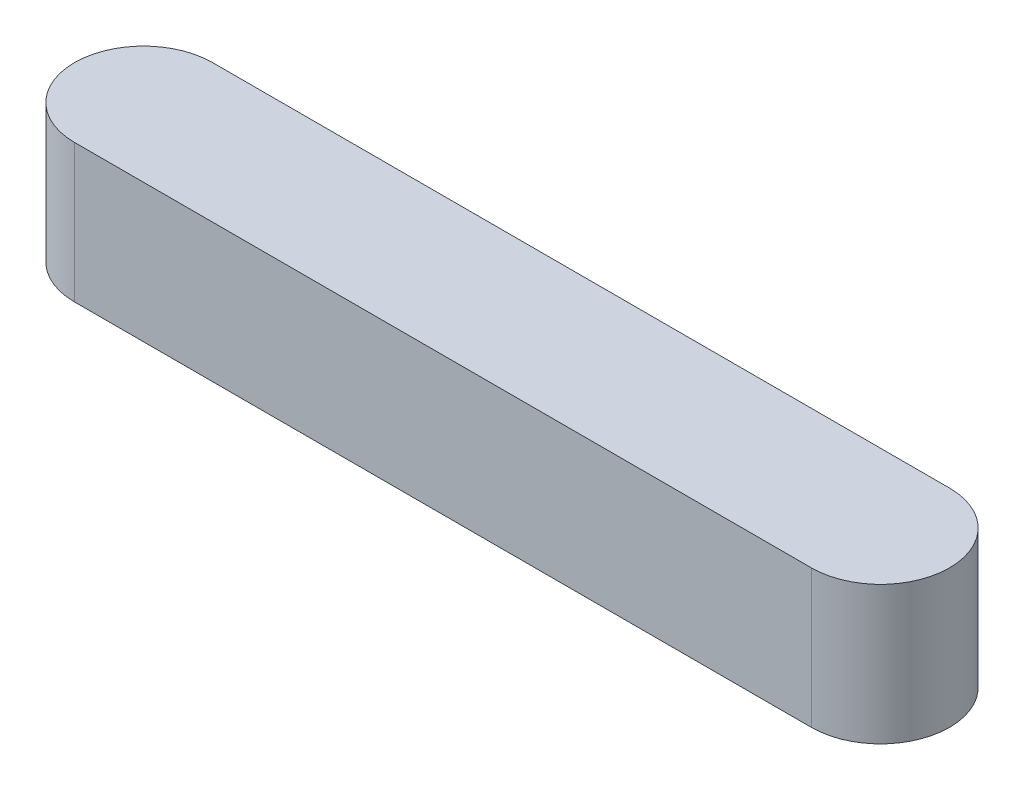
ISO-10303-21;
HEADER;
FILE_DESCRIPTION(('STEP AP214'),'2;1');
FILE_NAME('part.step','',(''),(''),'','','');
FILE_SCHEMA(('AUTOMOTIVE_DESIGN { 1 0 10303 214 1 1 1 1 }'));
ENDSEC;
DATA;
#1=APPLICATION_CONTEXT('core data for automotive mechanical design processes');
#2=APPLICATION_PROTOCOL_DEFINITION('international standard','automotive_design',2000,#1);
#3=PRODUCT_CONTEXT('',#1,'mechanical');
#4=PRODUCT('Part','Part','',(#3));
#5=PRODUCT_RELATED_PRODUCT_CATEGORY('part','',(#4));
#6=PRODUCT_DEFINITION_FORMATION('','',#4);
#7=PRODUCT_DEFINITION_CONTEXT('part definition',#1,'design');
#8=PRODUCT_DEFINITION('design','',#6,#7);
#9=PRODUCT_DEFINITION_SHAPE('','',#8);
#10=(LENGTH_UNIT() NAMED_UNIT(*) SI_UNIT(.MILLI.,.METRE.));
#11=(NAMED_UNIT(*) PLANE_ANGLE_UNIT() SI_UNIT($,.RADIAN.));
#12=(NAMED_UNIT(*) SI_UNIT($,.STERADIAN.) SOLID_ANGLE_UNIT());
#13=UNCERTAINTY_MEASURE_WITH_UNIT(LENGTH_MEASURE(1.E-05),#10,'distance_accuracy_value','');
#14=(GEOMETRIC_REPRESENTATION_CONTEXT(3) GLOBAL_UNCERTAINTY_ASSIGNED_CONTEXT((#13)) GLOBAL_UNIT_ASSIGNED_CONTEXT((#10,
#11,#12)) REPRESENTATION_CONTEXT('',''));
#15=CARTESIAN_POINT('',(0.,0.,0.));
#16=DIRECTION('',(0.,0.,1.));
#17=DIRECTION('',(1.,0.,0.));
#18=AXIS2_PLACEMENT_3D('',#15,#16,#17);
#19=CARTESIAN_POINT('',(-8.,3.,0.));
#20=DIRECTION('',(0.,-1.,0.));
#21=DIRECTION('',(0.,0.,-1.));
#22=AXIS2_PLACEMENT_3D('',#19,#20,#21);
#23=CYLINDRICAL_SURFACE('',#22,1.5);
#24=CARTESIAN_POINT('',(-8.,0.,0.));
#25=DIRECTION('',(0.,1.,0.));
#26=DIRECTION('',(0.,0.,1.));
#27=AXIS2_PLACEMENT_3D('',#24,#25,#26);
#28=CIRCLE('',#27,1.5);
#29=CARTESIAN_POINT('',(-8.,0.,-1.5));
#30=VERTEX_POINT('',#29);
#31=CARTESIAN_POINT('',(-8.,0.,1.5));
#32=VERTEX_POINT('',#31);
#33=EDGE_CURVE('E100',#30,#32,#28,.T.);
#34=ORIENTED_EDGE('',*,*,#33,.T.);
#35=DIRECTION('',(0.,-1.,0.));
#36=VECTOR('',#35,1.);
#37=CARTESIAN_POINT('',(-8.,3.,1.5));
#38=LINE('',#37,#36);
#39=CARTESIAN_POINT('',(-8.,3.,1.5));
#40=VERTEX_POINT('',#39);
#41=EDGE_CURVE('E11',#40,#32,#38,.T.);
#42=ORIENTED_EDGE('',*,*,#41,.F.);
#43=CARTESIAN_POINT('',(-8.,3.,0.));
#44=DIRECTION('',(0.,1.,0.));
#45=DIRECTION('',(0.,0.,1.));
#46=AXIS2_PLACEMENT_3D('',#43,#44,#45);
#47=CIRCLE('',#46,1.5);
#48=CARTESIAN_POINT('',(-8.,3.,-1.5));
#49=VERTEX_POINT('',#48);
#50=EDGE_CURVE('E88',#49,#40,#47,.T.);
#51=ORIENTED_EDGE('',*,*,#50,.F.);
#52=DIRECTION('',(0.,-1.,0.));
#53=VECTOR('',#52,1.);
#54=CARTESIAN_POINT('',(-8.,3.,-1.5));
#55=LINE('',#54,#53);
#56=EDGE_CURVE('E96',#49,#30,#55,.T.);
#57=ORIENTED_EDGE('',*,*,#56,.T.);
#58=EDGE_LOOP('',(#34,#42,#51,#57));
#59=FACE_BOUND('',#58,.T.);
#60=ADVANCED_FACE('F37',(#59),#23,.T.);
#61=CARTESIAN_POINT('',(-8.,3.,1.5));
#62=DIRECTION('',(0.,0.,-1.));
#63=DIRECTION('',(-1.,0.,0.));
#64=AXIS2_PLACEMENT_3D('',#61,#62,#63);
#65=PLANE('',#64);
#66=DIRECTION('',(1.,0.,0.));
#67=VECTOR('',#66,1.);
#68=CARTESIAN_POINT('',(-8.,0.,1.5));
#69=LINE('',#68,#67);
#70=CARTESIAN_POINT('',(8.,0.,1.5));
#71=VERTEX_POINT('',#70);
#72=EDGE_CURVE('E92',#32,#71,#69,.T.);
#73=ORIENTED_EDGE('',*,*,#72,.T.);
#74=DIRECTION('',(0.,-1.,0.));
#75=VECTOR('',#74,1.);
#76=CARTESIAN_POINT('',(8.,3.,1.5));
#77=LINE('',#76,#75);
#78=CARTESIAN_POINT('',(8.,3.,1.5));
#79=VERTEX_POINT('',#78);
#80=EDGE_CURVE('E45',#79,#71,#77,.T.);
#81=ORIENTED_EDGE('',*,*,#80,.F.);
#82=DIRECTION('',(1.,0.,0.));
#83=VECTOR('',#82,1.);
#84=CARTESIAN_POINT('',(-8.,3.,1.5));
#85=LINE('',#84,#83);
#86=EDGE_CURVE('E83',#40,#79,#85,.T.);
#87=ORIENTED_EDGE('',*,*,#86,.F.);
#88=ORIENTED_EDGE('',*,*,#41,.T.);
#89=EDGE_LOOP('',(#73,#81,#87,#88));
#90=FACE_BOUND('',#89,.T.);
#91=ADVANCED_FACE('F91',(#90),#65,.F.);
#92=CARTESIAN_POINT('',(8.,3.,0.));
#93=DIRECTION('',(0.,-1.,0.));
#94=DIRECTION('',(0.,0.,-1.));
#95=AXIS2_PLACEMENT_3D('',#92,#93,#94);
#96=CYLINDRICAL_SURFACE('',#95,1.5);
#97=CARTESIAN_POINT('',(8.,0.,0.));
#98=DIRECTION('',(0.,1.,0.));
#99=DIRECTION('',(0.,0.,1.));
#100=AXIS2_PLACEMENT_3D('',#97,#98,#99);
#101=CIRCLE('',#100,1.5);
#102=CARTESIAN_POINT('',(8.,0.,-1.5));
#103=VERTEX_POINT('',#102);
#104=EDGE_CURVE('E70',#71,#103,#101,.T.);
#105=ORIENTED_EDGE('',*,*,#104,.T.);
#106=DIRECTION('',(0.,-1.,0.));
#107=VECTOR('',#106,1.);
#108=CARTESIAN_POINT('',(8.,3.,-1.5));
#109=LINE('',#108,#107);
#110=CARTESIAN_POINT('',(8.,3.,-1.5));
#111=VERTEX_POINT('',#110);
#112=EDGE_CURVE('E93',#111,#103,#109,.T.);
#113=ORIENTED_EDGE('',*,*,#112,.F.);
#114=CARTESIAN_POINT('',(8.,3.,0.));
#115=DIRECTION('',(0.,1.,0.));
#116=DIRECTION('',(0.,0.,1.));
#117=AXIS2_PLACEMENT_3D('',#114,#115,#116);
#118=CIRCLE('',#117,1.5);
#119=EDGE_CURVE('E86',#79,#111,#118,.T.);
#120=ORIENTED_EDGE('',*,*,#119,.F.);
#121=ORIENTED_EDGE('',*,*,#80,.T.);
#122=EDGE_LOOP('',(#105,#113,#120,#121));
#123=FACE_BOUND('',#122,.T.);
#124=ADVANCED_FACE('F94',(#123),#96,.T.);
#125=CARTESIAN_POINT('',(-8.,3.,-1.5));
#126=DIRECTION('',(0.,0.,1.));
#127=DIRECTION('',(1.,0.,0.));
#128=AXIS2_PLACEMENT_3D('',#125,#126,#127);
#129=PLANE('',#128);
#130=DIRECTION('',(-1.,0.,0.));
#131=VECTOR('',#130,1.);
#132=CARTESIAN_POINT('',(-8.,0.,-1.5));
#133=LINE('',#132,#131);
#134=EDGE_CURVE('E76',#103,#30,#133,.T.);
#135=ORIENTED_EDGE('',*,*,#134,.T.);
#136=ORIENTED_EDGE('',*,*,#56,.F.);
#137=DIRECTION('',(-1.,0.,0.));
#138=VECTOR('',#137,1.);
#139=CARTESIAN_POINT('',(-8.,3.,-1.5));
#140=LINE('',#139,#138);
#141=EDGE_CURVE('E53',#111,#49,#140,.T.);
#142=ORIENTED_EDGE('',*,*,#141,.F.);
#143=ORIENTED_EDGE('',*,*,#112,.T.);
#144=EDGE_LOOP('',(#135,#136,#142,#143));
#145=FACE_BOUND('',#144,.T.);
#146=ADVANCED_FACE('F107',(#145),#129,.F.);
#147=CARTESIAN_POINT('',(-8.,3.,0.));
#148=DIRECTION('',(0.,1.,0.));
#149=DIRECTION('',(0.,0.,1.));
#150=AXIS2_PLACEMENT_3D('',#147,#148,#149);
#151=PLANE('',#150);
#152=ORIENTED_EDGE('',*,*,#50,.T.);
#153=ORIENTED_EDGE('',*,*,#86,.T.);
#154=ORIENTED_EDGE('',*,*,#119,.T.);
#155=ORIENTED_EDGE('',*,*,#141,.T.);
#156=EDGE_LOOP('',(#152,#153,#154,#155));
#157=FACE_BOUND('',#156,.T.);
#158=ADVANCED_FACE('F84',(#157),#151,.T.);
#159=CARTESIAN_POINT('',(-8.,0.,0.));
#160=DIRECTION('',(0.,1.,0.));
#161=DIRECTION('',(0.,0.,1.));
#162=AXIS2_PLACEMENT_3D('',#159,#160,#161);
#163=PLANE('',#162);
#164=ORIENTED_EDGE('',*,*,#33,.F.);
#165=ORIENTED_EDGE('',*,*,#134,.F.);
#166=ORIENTED_EDGE('',*,*,#104,.F.);
#167=ORIENTED_EDGE('',*,*,#72,.F.);
#168=EDGE_LOOP('',(#164,#165,#166,#167));
#169=FACE_BOUND('',#168,.T.);
#170=ADVANCED_FACE('F110',(#169),#163,.F.);
#171=CLOSED_SHELL('',(#60,#91,#124,#146,#158,#170));
#172=MANIFOLD_SOLID_BREP('B2',#171);
#173=ADVANCED_BREP_SHAPE_REPRESENTATION('',(#18,#172),#14);
#174=SHAPE_DEFINITION_REPRESENTATION(#9,#173);
ENDSEC;
END-ISO-10303-21;
